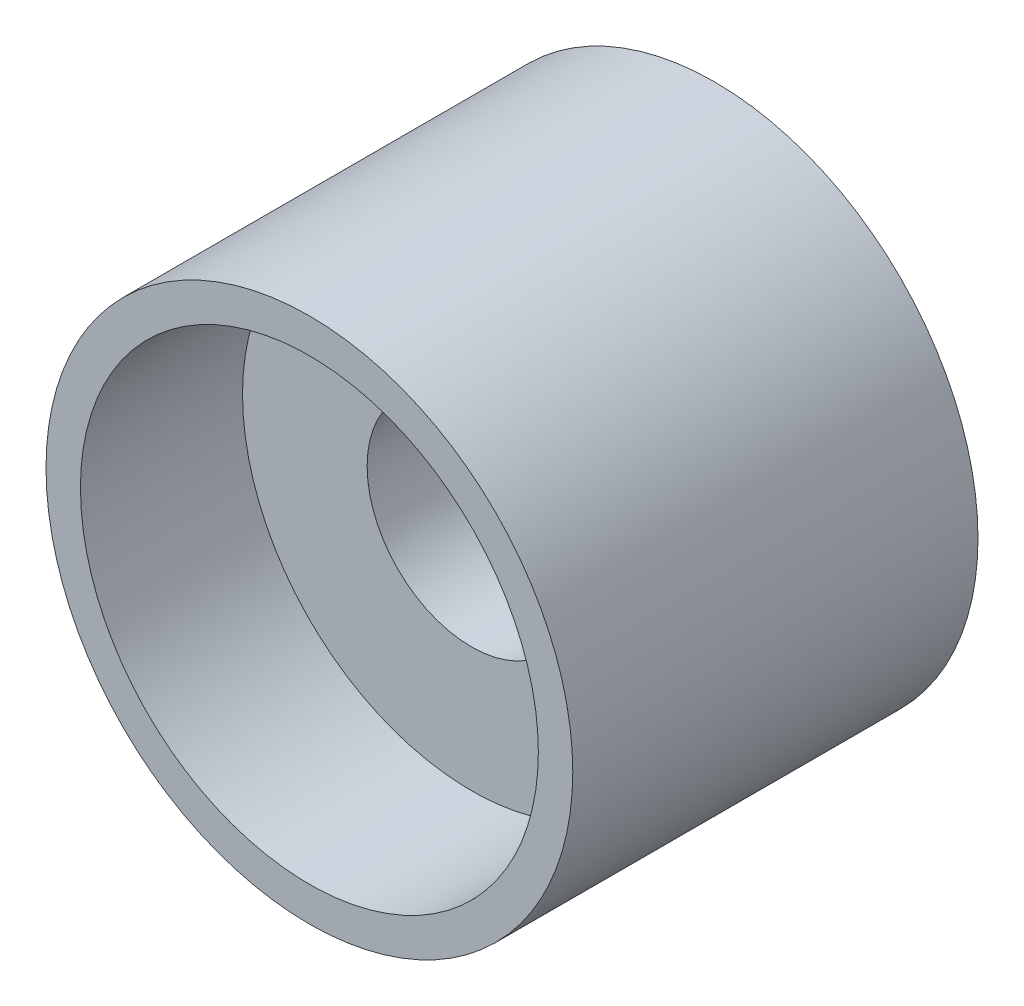
ISO-10303-21;
HEADER;
FILE_DESCRIPTION(('STEP AP214'),'2;1');
FILE_NAME('part.step','',(''),(''),'','','');
FILE_SCHEMA(('AUTOMOTIVE_DESIGN { 1 0 10303 214 1 1 1 1 }'));
ENDSEC;
DATA;
#1=APPLICATION_CONTEXT('core data for automotive mechanical design processes');
#2=APPLICATION_PROTOCOL_DEFINITION('international standard','automotive_design',2000,#1);
#3=PRODUCT_CONTEXT('',#1,'mechanical');
#4=PRODUCT('Part','Part','',(#3));
#5=PRODUCT_RELATED_PRODUCT_CATEGORY('part','',(#4));
#6=PRODUCT_DEFINITION_FORMATION('','',#4);
#7=PRODUCT_DEFINITION_CONTEXT('part definition',#1,'design');
#8=PRODUCT_DEFINITION('design','',#6,#7);
#9=PRODUCT_DEFINITION_SHAPE('','',#8);
#10=(LENGTH_UNIT() NAMED_UNIT(*) SI_UNIT(.MILLI.,.METRE.));
#11=(NAMED_UNIT(*) PLANE_ANGLE_UNIT() SI_UNIT($,.RADIAN.));
#12=(NAMED_UNIT(*) SI_UNIT($,.STERADIAN.) SOLID_ANGLE_UNIT());
#13=UNCERTAINTY_MEASURE_WITH_UNIT(LENGTH_MEASURE(1.E-05),#10,'distance_accuracy_value','');
#14=(GEOMETRIC_REPRESENTATION_CONTEXT(3) GLOBAL_UNCERTAINTY_ASSIGNED_CONTEXT((#13)) GLOBAL_UNIT_ASSIGNED_CONTEXT((#10,
#11,#12)) REPRESENTATION_CONTEXT('',''));
#15=CARTESIAN_POINT('',(0.,0.,0.));
#16=DIRECTION('',(0.,0.,1.));
#17=DIRECTION('',(1.,0.,0.));
#18=AXIS2_PLACEMENT_3D('',#15,#16,#17);
#19=CARTESIAN_POINT('',(0.,0.,20.));
#20=DIRECTION('',(0.,0.,-1.));
#21=DIRECTION('',(-1.,0.,0.));
#22=AXIS2_PLACEMENT_3D('',#19,#20,#21);
#23=CYLINDRICAL_SURFACE('',#22,5.15);
#24=CARTESIAN_POINT('',(0.,0.,0.));
#25=DIRECTION('',(0.,0.,1.));
#26=DIRECTION('',(1.,0.,0.));
#27=AXIS2_PLACEMENT_3D('',#24,#25,#26);
#28=CIRCLE('',#27,5.15);
#29=CARTESIAN_POINT('',(5.15,0.,0.));
#30=VERTEX_POINT('',#29);
#31=EDGE_CURVE('E44',#30,#30,#28,.T.);
#32=ORIENTED_EDGE('',*,*,#31,.F.);
#33=EDGE_LOOP('',(#32));
#34=FACE_BOUND('',#33,.T.);
#35=CARTESIAN_POINT('',(0.,0.,12.));
#36=DIRECTION('',(0.,0.,1.));
#37=DIRECTION('',(1.,0.,0.));
#38=AXIS2_PLACEMENT_3D('',#35,#36,#37);
#39=CIRCLE('',#38,5.15);
#40=CARTESIAN_POINT('',(5.15,0.,12.));
#41=VERTEX_POINT('',#40);
#42=EDGE_CURVE('E35',#41,#41,#39,.T.);
#43=ORIENTED_EDGE('',*,*,#42,.T.);
#44=EDGE_LOOP('',(#43));
#45=FACE_BOUND('',#44,.T.);
#46=ADVANCED_FACE('F31',(#34,#45),#23,.F.);
#47=CARTESIAN_POINT('',(0.,0.,20.));
#48=DIRECTION('',(0.,0.,1.));
#49=DIRECTION('',(1.,0.,0.));
#50=AXIS2_PLACEMENT_3D('',#47,#48,#49);
#51=PLANE('',#50);
#52=CARTESIAN_POINT('',(0.,0.,20.));
#53=DIRECTION('',(0.,0.,1.));
#54=DIRECTION('',(1.,0.,0.));
#55=AXIS2_PLACEMENT_3D('',#52,#53,#54);
#56=CIRCLE('',#55,11.3);
#57=CARTESIAN_POINT('',(11.3,0.,20.));
#58=VERTEX_POINT('',#57);
#59=EDGE_CURVE('E48',#58,#58,#56,.T.);
#60=ORIENTED_EDGE('',*,*,#59,.F.);
#61=EDGE_LOOP('',(#60));
#62=FACE_BOUND('',#61,.T.);
#63=CARTESIAN_POINT('',(0.,0.,20.));
#64=DIRECTION('',(0.,0.,1.));
#65=DIRECTION('',(1.,0.,0.));
#66=AXIS2_PLACEMENT_3D('',#63,#64,#65);
#67=CIRCLE('',#66,13.);
#68=CARTESIAN_POINT('',(13.,0.,20.));
#69=VERTEX_POINT('',#68);
#70=EDGE_CURVE('E10',#69,#69,#67,.T.);
#71=ORIENTED_EDGE('',*,*,#70,.T.);
#72=EDGE_LOOP('',(#71));
#73=FACE_BOUND('',#72,.T.);
#74=ADVANCED_FACE('F69',(#62,#73),#51,.T.);
#75=CARTESIAN_POINT('',(0.,0.,0.));
#76=DIRECTION('',(0.,0.,1.));
#77=DIRECTION('',(1.,0.,0.));
#78=AXIS2_PLACEMENT_3D('',#75,#76,#77);
#79=PLANE('',#78);
#80=CARTESIAN_POINT('',(0.,0.,0.));
#81=DIRECTION('',(0.,0.,1.));
#82=DIRECTION('',(1.,0.,0.));
#83=AXIS2_PLACEMENT_3D('',#80,#81,#82);
#84=CIRCLE('',#83,13.);
#85=CARTESIAN_POINT('',(13.,0.,0.));
#86=VERTEX_POINT('',#85);
#87=EDGE_CURVE('E39',#86,#86,#84,.T.);
#88=ORIENTED_EDGE('',*,*,#87,.F.);
#89=EDGE_LOOP('',(#88));
#90=FACE_BOUND('',#89,.T.);
#91=ORIENTED_EDGE('',*,*,#31,.T.);
#92=EDGE_LOOP('',(#91));
#93=FACE_BOUND('',#92,.T.);
#94=ADVANCED_FACE('F75',(#90,#93),#79,.F.);
#95=CARTESIAN_POINT('',(0.,0.,20.));
#96=DIRECTION('',(0.,0.,-1.));
#97=DIRECTION('',(-1.,0.,0.));
#98=AXIS2_PLACEMENT_3D('',#95,#96,#97);
#99=CYLINDRICAL_SURFACE('',#98,13.);
#100=ORIENTED_EDGE('',*,*,#70,.F.);
#101=EDGE_LOOP('',(#100));
#102=FACE_BOUND('',#101,.T.);
#103=ORIENTED_EDGE('',*,*,#87,.T.);
#104=EDGE_LOOP('',(#103));
#105=FACE_BOUND('',#104,.T.);
#106=ADVANCED_FACE('F33',(#102,#105),#99,.T.);
#107=CARTESIAN_POINT('',(0.,0.,12.));
#108=DIRECTION('',(0.,0.,1.));
#109=DIRECTION('',(1.,0.,0.));
#110=AXIS2_PLACEMENT_3D('',#107,#108,#109);
#111=CYLINDRICAL_SURFACE('',#110,11.3);
#112=CARTESIAN_POINT('',(0.,0.,12.));
#113=DIRECTION('',(0.,0.,1.));
#114=DIRECTION('',(1.,0.,0.));
#115=AXIS2_PLACEMENT_3D('',#112,#113,#114);
#116=CIRCLE('',#115,11.3);
#117=CARTESIAN_POINT('',(11.3,0.,12.));
#118=VERTEX_POINT('',#117);
#119=EDGE_CURVE('E51',#118,#118,#116,.T.);
#120=ORIENTED_EDGE('',*,*,#119,.F.);
#121=EDGE_LOOP('',(#120));
#122=FACE_BOUND('',#121,.T.);
#123=ORIENTED_EDGE('',*,*,#59,.T.);
#124=EDGE_LOOP('',(#123));
#125=FACE_BOUND('',#124,.T.);
#126=ADVANCED_FACE('F61',(#122,#125),#111,.F.);
#127=CARTESIAN_POINT('',(0.,0.,12.));
#128=DIRECTION('',(0.,0.,1.));
#129=DIRECTION('',(1.,0.,0.));
#130=AXIS2_PLACEMENT_3D('',#127,#128,#129);
#131=PLANE('',#130);
#132=ORIENTED_EDGE('',*,*,#42,.F.);
#133=EDGE_LOOP('',(#132));
#134=FACE_BOUND('',#133,.T.);
#135=ORIENTED_EDGE('',*,*,#119,.T.);
#136=EDGE_LOOP('',(#135));
#137=FACE_BOUND('',#136,.T.);
#138=ADVANCED_FACE('F59',(#134,#137),#131,.T.);
#139=CLOSED_SHELL('',(#46,#74,#94,#106,#126,#138));
#140=MANIFOLD_SOLID_BREP('B2',#139);
#141=ADVANCED_BREP_SHAPE_REPRESENTATION('',(#18,#140),#14);
#142=SHAPE_DEFINITION_REPRESENTATION(#9,#141);
ENDSEC;
END-ISO-10303-21;
